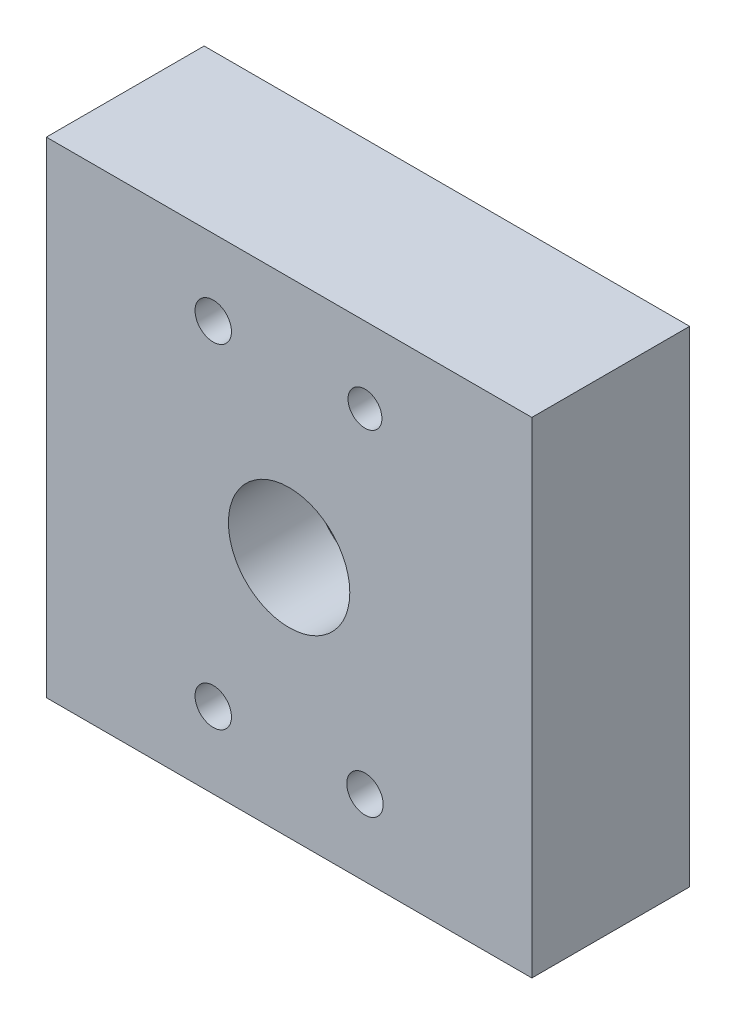
ISO-10303-21;
HEADER;
FILE_DESCRIPTION(('STEP AP214'),'2;1');
FILE_NAME('part.step','',(''),(''),'','','');
FILE_SCHEMA(('AUTOMOTIVE_DESIGN { 1 0 10303 214 1 1 1 1 }'));
ENDSEC;
DATA;
#1=APPLICATION_CONTEXT('core data for automotive mechanical design processes');
#2=APPLICATION_PROTOCOL_DEFINITION('international standard','automotive_design',2000,#1);
#3=PRODUCT_CONTEXT('',#1,'mechanical');
#4=PRODUCT('Part','Part','',(#3));
#5=PRODUCT_RELATED_PRODUCT_CATEGORY('part','',(#4));
#6=PRODUCT_DEFINITION_FORMATION('','',#4);
#7=PRODUCT_DEFINITION_CONTEXT('part definition',#1,'design');
#8=PRODUCT_DEFINITION('design','',#6,#7);
#9=PRODUCT_DEFINITION_SHAPE('','',#8);
#10=(LENGTH_UNIT() NAMED_UNIT(*) SI_UNIT(.MILLI.,.METRE.));
#11=(NAMED_UNIT(*) PLANE_ANGLE_UNIT() SI_UNIT($,.RADIAN.));
#12=(NAMED_UNIT(*) SI_UNIT($,.STERADIAN.) SOLID_ANGLE_UNIT());
#13=UNCERTAINTY_MEASURE_WITH_UNIT(LENGTH_MEASURE(1.E-05),#10,'distance_accuracy_value','');
#14=(GEOMETRIC_REPRESENTATION_CONTEXT(3) GLOBAL_UNCERTAINTY_ASSIGNED_CONTEXT((#13)) GLOBAL_UNIT_ASSIGNED_CONTEXT((#10,
#11,#12)) REPRESENTATION_CONTEXT('',''));
#15=CARTESIAN_POINT('',(0.,0.,0.));
#16=DIRECTION('',(0.,0.,1.));
#17=DIRECTION('',(1.,0.,0.));
#18=AXIS2_PLACEMENT_3D('',#15,#16,#17);
#19=CARTESIAN_POINT('',(-6.25,-13.75,27.));
#20=DIRECTION('',(0.,0.,-1.));
#21=DIRECTION('',(-1.,0.,0.));
#22=AXIS2_PLACEMENT_3D('',#19,#20,#21);
#23=CYLINDRICAL_SURFACE('',#22,1.5);
#24=CARTESIAN_POINT('',(-6.25,-13.75,13.));
#25=DIRECTION('',(0.,0.,1.));
#26=DIRECTION('',(1.,0.,0.));
#27=AXIS2_PLACEMENT_3D('',#24,#25,#26);
#28=CIRCLE('',#27,1.5);
#29=CARTESIAN_POINT('',(-4.75,-13.75,13.));
#30=VERTEX_POINT('',#29);
#31=EDGE_CURVE('E254',#30,#30,#28,.T.);
#32=ORIENTED_EDGE('',*,*,#31,.T.);
#33=EDGE_LOOP('',(#32));
#34=FACE_BOUND('',#33,.T.);
#35=CARTESIAN_POINT('',(-6.25,-13.75,3.));
#36=DIRECTION('',(0.,0.,-1.));
#37=DIRECTION('',(-1.,0.,0.));
#38=AXIS2_PLACEMENT_3D('',#35,#36,#37);
#39=CIRCLE('',#38,1.5);
#40=CARTESIAN_POINT('',(-7.75,-13.75,3.));
#41=VERTEX_POINT('',#40);
#42=EDGE_CURVE('E361',#41,#41,#39,.T.);
#43=ORIENTED_EDGE('',*,*,#42,.T.);
#44=EDGE_LOOP('',(#43));
#45=FACE_BOUND('',#44,.T.);
#46=ADVANCED_FACE('F47',(#34,#45),#23,.F.);
#47=CARTESIAN_POINT('',(6.25,-13.75,27.));
#48=DIRECTION('',(0.,0.,-1.));
#49=DIRECTION('',(-1.,0.,0.));
#50=AXIS2_PLACEMENT_3D('',#47,#48,#49);
#51=CYLINDRICAL_SURFACE('',#50,1.5);
#52=CARTESIAN_POINT('',(6.25,-13.75,13.));
#53=DIRECTION('',(0.,0.,1.));
#54=DIRECTION('',(1.,0.,0.));
#55=AXIS2_PLACEMENT_3D('',#52,#53,#54);
#56=CIRCLE('',#55,1.5);
#57=CARTESIAN_POINT('',(7.75,-13.75,13.));
#58=VERTEX_POINT('',#57);
#59=EDGE_CURVE('E257',#58,#58,#56,.T.);
#60=ORIENTED_EDGE('',*,*,#59,.T.);
#61=EDGE_LOOP('',(#60));
#62=FACE_BOUND('',#61,.T.);
#63=CARTESIAN_POINT('',(6.25,-13.75,3.));
#64=DIRECTION('',(0.,0.,-1.));
#65=DIRECTION('',(-1.,0.,0.));
#66=AXIS2_PLACEMENT_3D('',#63,#64,#65);
#67=CIRCLE('',#66,1.5);
#68=CARTESIAN_POINT('',(4.75,-13.75,3.));
#69=VERTEX_POINT('',#68);
#70=EDGE_CURVE('E347',#69,#69,#67,.T.);
#71=ORIENTED_EDGE('',*,*,#70,.T.);
#72=EDGE_LOOP('',(#71));
#73=FACE_BOUND('',#72,.T.);
#74=ADVANCED_FACE('F317',(#62,#73),#51,.F.);
#75=CARTESIAN_POINT('',(6.25000000000029,13.75,27.));
#76=DIRECTION('',(0.,0.,-1.));
#77=DIRECTION('',(-1.,0.,0.));
#78=AXIS2_PLACEMENT_3D('',#75,#76,#77);
#79=CYLINDRICAL_SURFACE('',#78,1.39539076412835);
#80=CARTESIAN_POINT('',(6.25000000000029,13.75,13.));
#81=DIRECTION('',(0.,0.,1.));
#82=DIRECTION('',(1.,0.,0.));
#83=AXIS2_PLACEMENT_3D('',#80,#81,#82);
#84=CIRCLE('',#83,1.39539076412835);
#85=CARTESIAN_POINT('',(7.64539076412863,13.75,13.));
#86=VERTEX_POINT('',#85);
#87=EDGE_CURVE('E260',#86,#86,#84,.T.);
#88=ORIENTED_EDGE('',*,*,#87,.T.);
#89=EDGE_LOOP('',(#88));
#90=FACE_BOUND('',#89,.T.);
#91=CARTESIAN_POINT('',(6.25000000000029,13.75,3.));
#92=DIRECTION('',(0.,0.,-1.));
#93=DIRECTION('',(-1.,0.,0.));
#94=AXIS2_PLACEMENT_3D('',#91,#92,#93);
#95=CIRCLE('',#94,1.39539076412835);
#96=CARTESIAN_POINT('',(4.85460923587194,13.75,3.));
#97=VERTEX_POINT('',#96);
#98=EDGE_CURVE('E51',#97,#97,#95,.F.);
#99=ORIENTED_EDGE('',*,*,#98,.F.);
#100=EDGE_LOOP('',(#99));
#101=FACE_BOUND('',#100,.T.);
#102=ADVANCED_FACE('F324',(#90,#101),#79,.F.);
#103=CARTESIAN_POINT('',(-6.24999999999972,13.75,27.));
#104=DIRECTION('',(0.,0.,-1.));
#105=DIRECTION('',(-1.,0.,0.));
#106=AXIS2_PLACEMENT_3D('',#103,#104,#105);
#107=CYLINDRICAL_SURFACE('',#106,1.5);
#108=CARTESIAN_POINT('',(-6.24999999999972,13.75,13.));
#109=DIRECTION('',(0.,0.,1.));
#110=DIRECTION('',(1.,0.,0.));
#111=AXIS2_PLACEMENT_3D('',#108,#109,#110);
#112=CIRCLE('',#111,1.5);
#113=CARTESIAN_POINT('',(-4.74999999999972,13.75,13.));
#114=VERTEX_POINT('',#113);
#115=EDGE_CURVE('E262',#114,#114,#112,.T.);
#116=ORIENTED_EDGE('',*,*,#115,.T.);
#117=EDGE_LOOP('',(#116));
#118=FACE_BOUND('',#117,.T.);
#119=CARTESIAN_POINT('',(-6.24999999999972,13.75,3.));
#120=DIRECTION('',(0.,0.,-1.));
#121=DIRECTION('',(-1.,0.,0.));
#122=AXIS2_PLACEMENT_3D('',#119,#120,#121);
#123=CIRCLE('',#122,1.5);
#124=CARTESIAN_POINT('',(-7.74999999999972,13.75,3.));
#125=VERTEX_POINT('',#124);
#126=EDGE_CURVE('E373',#125,#125,#123,.T.);
#127=ORIENTED_EDGE('',*,*,#126,.T.);
#128=EDGE_LOOP('',(#127));
#129=FACE_BOUND('',#128,.T.);
#130=ADVANCED_FACE('F330',(#118,#129),#107,.F.);
#131=CARTESIAN_POINT('',(13.,0.,6.));
#132=DIRECTION('',(1.,0.,0.));
#133=DIRECTION('',(0.,0.,-1.));
#134=AXIS2_PLACEMENT_3D('',#131,#132,#133);
#135=PLANE('',#134);
#136=DIRECTION('',(0.,-1.,0.));
#137=VECTOR('',#136,1.);
#138=CARTESIAN_POINT('',(13.,0.,0.));
#139=LINE('',#138,#137);
#140=CARTESIAN_POINT('',(13.,5.,0.));
#141=VERTEX_POINT('',#140);
#142=CARTESIAN_POINT('',(13.,-8.,0.));
#143=VERTEX_POINT('',#142);
#144=EDGE_CURVE('E220',#141,#143,#139,.T.);
#145=ORIENTED_EDGE('',*,*,#144,.T.);
#146=DIRECTION('',(0.,0.,-1.));
#147=VECTOR('',#146,1.);
#148=CARTESIAN_POINT('',(13.,-8.,6.));
#149=LINE('',#148,#147);
#150=CARTESIAN_POINT('',(13.,-8.,6.));
#151=VERTEX_POINT('',#150);
#152=EDGE_CURVE('E11',#151,#143,#149,.T.);
#153=ORIENTED_EDGE('',*,*,#152,.F.);
#154=DIRECTION('',(0.,-1.,0.));
#155=VECTOR('',#154,1.);
#156=CARTESIAN_POINT('',(13.,0.,6.));
#157=LINE('',#156,#155);
#158=CARTESIAN_POINT('',(13.,5.,6.));
#159=VERTEX_POINT('',#158);
#160=EDGE_CURVE('E177',#159,#151,#157,.T.);
#161=ORIENTED_EDGE('',*,*,#160,.F.);
#162=DIRECTION('',(0.,0.,-1.));
#163=VECTOR('',#162,1.);
#164=CARTESIAN_POINT('',(13.,5.,6.));
#165=LINE('',#164,#163);
#166=EDGE_CURVE('E238',#159,#141,#165,.T.);
#167=ORIENTED_EDGE('',*,*,#166,.T.);
#168=EDGE_LOOP('',(#145,#153,#161,#167));
#169=FACE_BOUND('',#168,.T.);
#170=ADVANCED_FACE('F302',(#169),#135,.F.);
#171=CARTESIAN_POINT('',(0.,-8.,6.));
#172=DIRECTION('',(0.,-1.,0.));
#173=DIRECTION('',(0.,0.,-1.));
#174=AXIS2_PLACEMENT_3D('',#171,#172,#173);
#175=PLANE('',#174);
#176=DIRECTION('',(-1.,0.,0.));
#177=VECTOR('',#176,1.);
#178=CARTESIAN_POINT('',(0.,-8.,0.));
#179=LINE('',#178,#177);
#180=CARTESIAN_POINT('',(5.,-8.,0.));
#181=VERTEX_POINT('',#180);
#182=EDGE_CURVE('E223',#143,#181,#179,.T.);
#183=ORIENTED_EDGE('',*,*,#182,.T.);
#184=DIRECTION('',(0.,0.,-1.));
#185=VECTOR('',#184,1.);
#186=CARTESIAN_POINT('',(5.,-8.,6.));
#187=LINE('',#186,#185);
#188=CARTESIAN_POINT('',(5.,-8.,6.));
#189=VERTEX_POINT('',#188);
#190=EDGE_CURVE('E56',#189,#181,#187,.T.);
#191=ORIENTED_EDGE('',*,*,#190,.F.);
#192=DIRECTION('',(-1.,0.,0.));
#193=VECTOR('',#192,1.);
#194=CARTESIAN_POINT('',(0.,-8.,6.));
#195=LINE('',#194,#193);
#196=EDGE_CURVE('E187',#151,#189,#195,.T.);
#197=ORIENTED_EDGE('',*,*,#196,.F.);
#198=ORIENTED_EDGE('',*,*,#152,.T.);
#199=EDGE_LOOP('',(#183,#191,#197,#198));
#200=FACE_BOUND('',#199,.T.);
#201=ADVANCED_FACE('F300',(#200),#175,.F.);
#202=CARTESIAN_POINT('',(5.,0.,6.));
#203=DIRECTION('',(1.,0.,0.));
#204=DIRECTION('',(0.,1.,0.));
#205=AXIS2_PLACEMENT_3D('',#202,#203,#204);
#206=PLANE('',#205);
#207=DIRECTION('',(0.,-1.,0.));
#208=VECTOR('',#207,1.);
#209=CARTESIAN_POINT('',(5.,0.,0.));
#210=LINE('',#209,#208);
#211=CARTESIAN_POINT('',(5.,-5.,0.));
#212=VERTEX_POINT('',#211);
#213=EDGE_CURVE('E226',#212,#181,#210,.T.);
#214=ORIENTED_EDGE('',*,*,#213,.F.);
#215=DIRECTION('',(0.,0.,-1.));
#216=VECTOR('',#215,1.);
#217=CARTESIAN_POINT('',(5.,-5.,6.));
#218=LINE('',#217,#216);
#219=CARTESIAN_POINT('',(5.,-5.,6.));
#220=VERTEX_POINT('',#219);
#221=EDGE_CURVE('E247',#220,#212,#218,.T.);
#222=ORIENTED_EDGE('',*,*,#221,.F.);
#223=DIRECTION('',(0.,-1.,0.));
#224=VECTOR('',#223,1.);
#225=CARTESIAN_POINT('',(5.,0.,6.));
#226=LINE('',#225,#224);
#227=EDGE_CURVE('E190',#220,#189,#226,.T.);
#228=ORIENTED_EDGE('',*,*,#227,.T.);
#229=ORIENTED_EDGE('',*,*,#190,.T.);
#230=EDGE_LOOP('',(#214,#222,#228,#229));
#231=FACE_BOUND('',#230,.T.);
#232=ADVANCED_FACE('F297',(#231),#206,.T.);
#233=CARTESIAN_POINT('',(0.,-5.,6.));
#234=DIRECTION('',(0.,1.,0.));
#235=DIRECTION('',(0.,0.,1.));
#236=AXIS2_PLACEMENT_3D('',#233,#234,#235);
#237=PLANE('',#236);
#238=DIRECTION('',(1.,0.,0.));
#239=VECTOR('',#238,1.);
#240=CARTESIAN_POINT('',(0.,-5.,0.));
#241=LINE('',#240,#239);
#242=CARTESIAN_POINT('',(-5.,-5.,0.));
#243=VERTEX_POINT('',#242);
#244=EDGE_CURVE('E229',#243,#212,#241,.T.);
#245=ORIENTED_EDGE('',*,*,#244,.F.);
#246=DIRECTION('',(0.,0.,-1.));
#247=VECTOR('',#246,1.);
#248=CARTESIAN_POINT('',(-5.,-5.,6.));
#249=LINE('',#248,#247);
#250=CARTESIAN_POINT('',(-5.,-5.,6.));
#251=VERTEX_POINT('',#250);
#252=EDGE_CURVE('E245',#251,#243,#249,.T.);
#253=ORIENTED_EDGE('',*,*,#252,.F.);
#254=DIRECTION('',(1.,0.,0.));
#255=VECTOR('',#254,1.);
#256=CARTESIAN_POINT('',(0.,-5.,6.));
#257=LINE('',#256,#255);
#258=CARTESIAN_POINT('',(0.,-5.,6.));
#259=VERTEX_POINT('',#258);
#260=EDGE_CURVE('E194',#251,#259,#257,.T.);
#261=ORIENTED_EDGE('',*,*,#260,.T.);
#262=EDGE_CURVE('E193',#259,#220,#257,.T.);
#263=ORIENTED_EDGE('',*,*,#262,.T.);
#264=ORIENTED_EDGE('',*,*,#221,.T.);
#265=EDGE_LOOP('',(#245,#253,#261,#263,#264));
#266=FACE_BOUND('',#265,.T.);
#267=ADVANCED_FACE('F292',(#266),#237,.T.);
#268=CARTESIAN_POINT('',(-5.,0.,6.));
#269=DIRECTION('',(-1.,0.,0.));
#270=DIRECTION('',(0.,0.,1.));
#271=AXIS2_PLACEMENT_3D('',#268,#269,#270);
#272=PLANE('',#271);
#273=DIRECTION('',(0.,1.,0.));
#274=VECTOR('',#273,1.);
#275=CARTESIAN_POINT('',(-5.,0.,0.));
#276=LINE('',#275,#274);
#277=CARTESIAN_POINT('',(-5.,5.,0.));
#278=VERTEX_POINT('',#277);
#279=EDGE_CURVE('E232',#243,#278,#276,.T.);
#280=ORIENTED_EDGE('',*,*,#279,.T.);
#281=DIRECTION('',(0.,0.,-1.));
#282=VECTOR('',#281,1.);
#283=CARTESIAN_POINT('',(-5.,5.,6.));
#284=LINE('',#283,#282);
#285=CARTESIAN_POINT('',(-5.,5.,6.));
#286=VERTEX_POINT('',#285);
#287=EDGE_CURVE('E241',#286,#278,#284,.T.);
#288=ORIENTED_EDGE('',*,*,#287,.F.);
#289=DIRECTION('',(0.,1.,0.));
#290=VECTOR('',#289,1.);
#291=CARTESIAN_POINT('',(-5.,0.,6.));
#292=LINE('',#291,#290);
#293=CARTESIAN_POINT('',(-5.,0.,6.));
#294=VERTEX_POINT('',#293);
#295=EDGE_CURVE('E72',#294,#286,#292,.T.);
#296=ORIENTED_EDGE('',*,*,#295,.F.);
#297=EDGE_CURVE('E196',#251,#294,#292,.T.);
#298=ORIENTED_EDGE('',*,*,#297,.F.);
#299=ORIENTED_EDGE('',*,*,#252,.T.);
#300=EDGE_LOOP('',(#280,#288,#296,#298,#299));
#301=FACE_BOUND('',#300,.T.);
#302=ADVANCED_FACE('F283',(#301),#272,.F.);
#303=CARTESIAN_POINT('',(20.,0.,6.));
#304=DIRECTION('',(-1.,0.,0.));
#305=DIRECTION('',(0.,0.,1.));
#306=AXIS2_PLACEMENT_3D('',#303,#304,#305);
#307=PLANE('',#306);
#308=DIRECTION('',(0.,1.,0.));
#309=VECTOR('',#308,1.);
#310=CARTESIAN_POINT('',(20.,0.,0.));
#311=LINE('',#310,#309);
#312=CARTESIAN_POINT('',(20.,-20.,0.));
#313=VERTEX_POINT('',#312);
#314=CARTESIAN_POINT('',(20.,20.,0.));
#315=VERTEX_POINT('',#314);
#316=EDGE_CURVE('E211',#313,#315,#311,.T.);
#317=ORIENTED_EDGE('',*,*,#316,.T.);
#318=DIRECTION('',(0.,0.,-1.));
#319=VECTOR('',#318,1.);
#320=CARTESIAN_POINT('',(20.,20.,6.));
#321=LINE('',#320,#319);
#322=CARTESIAN_POINT('',(20.,20.,13.));
#323=VERTEX_POINT('',#322);
#324=EDGE_CURVE('E242',#323,#315,#321,.T.);
#325=ORIENTED_EDGE('',*,*,#324,.F.);
#326=DIRECTION('',(0.,1.,0.));
#327=VECTOR('',#326,1.);
#328=CARTESIAN_POINT('',(20.,20.,13.));
#329=LINE('',#328,#327);
#330=CARTESIAN_POINT('',(20.,-20.,13.));
#331=VERTEX_POINT('',#330);
#332=EDGE_CURVE('E157',#331,#323,#329,.T.);
#333=ORIENTED_EDGE('',*,*,#332,.F.);
#334=DIRECTION('',(0.,0.,-1.));
#335=VECTOR('',#334,1.);
#336=CARTESIAN_POINT('',(20.,-20.,6.));
#337=LINE('',#336,#335);
#338=EDGE_CURVE('E149',#331,#313,#337,.T.);
#339=ORIENTED_EDGE('',*,*,#338,.T.);
#340=EDGE_LOOP('',(#317,#325,#333,#339));
#341=FACE_BOUND('',#340,.T.);
#342=ADVANCED_FACE('F396',(#341),#307,.F.);
#343=CARTESIAN_POINT('',(0.,20.,6.));
#344=DIRECTION('',(0.,-1.,0.));
#345=DIRECTION('',(0.,0.,-1.));
#346=AXIS2_PLACEMENT_3D('',#343,#344,#345);
#347=PLANE('',#346);
#348=DIRECTION('',(-1.,0.,0.));
#349=VECTOR('',#348,1.);
#350=CARTESIAN_POINT('',(0.,20.,0.));
#351=LINE('',#350,#349);
#352=CARTESIAN_POINT('',(-20.,20.,0.));
#353=VERTEX_POINT('',#352);
#354=EDGE_CURVE('E214',#315,#353,#351,.T.);
#355=ORIENTED_EDGE('',*,*,#354,.T.);
#356=DIRECTION('',(0.,0.,-1.));
#357=VECTOR('',#356,1.);
#358=CARTESIAN_POINT('',(-20.,20.,6.));
#359=LINE('',#358,#357);
#360=CARTESIAN_POINT('',(-20.,20.,13.));
#361=VERTEX_POINT('',#360);
#362=EDGE_CURVE('E148',#361,#353,#359,.T.);
#363=ORIENTED_EDGE('',*,*,#362,.F.);
#364=DIRECTION('',(-1.,0.,0.));
#365=VECTOR('',#364,1.);
#366=CARTESIAN_POINT('',(-20.,20.,13.));
#367=LINE('',#366,#365);
#368=EDGE_CURVE('E163',#323,#361,#367,.T.);
#369=ORIENTED_EDGE('',*,*,#368,.F.);
#370=ORIENTED_EDGE('',*,*,#324,.T.);
#371=EDGE_LOOP('',(#355,#363,#369,#370));
#372=FACE_BOUND('',#371,.T.);
#373=ADVANCED_FACE('F398',(#372),#347,.F.);
#374=CARTESIAN_POINT('',(-20.,0.,6.));
#375=DIRECTION('',(-1.,0.,0.));
#376=DIRECTION('',(0.,0.,1.));
#377=AXIS2_PLACEMENT_3D('',#374,#375,#376);
#378=PLANE('',#377);
#379=DIRECTION('',(0.,1.,0.));
#380=VECTOR('',#379,1.);
#381=CARTESIAN_POINT('',(-20.,0.,0.));
#382=LINE('',#381,#380);
#383=CARTESIAN_POINT('',(-20.,-20.,0.));
#384=VERTEX_POINT('',#383);
#385=EDGE_CURVE('E144',#384,#353,#382,.T.);
#386=ORIENTED_EDGE('',*,*,#385,.F.);
#387=DIRECTION('',(0.,0.,-1.));
#388=VECTOR('',#387,1.);
#389=CARTESIAN_POINT('',(-20.,-20.,6.));
#390=LINE('',#389,#388);
#391=CARTESIAN_POINT('',(-20.,-20.,13.));
#392=VERTEX_POINT('',#391);
#393=EDGE_CURVE('E138',#392,#384,#390,.T.);
#394=ORIENTED_EDGE('',*,*,#393,.F.);
#395=DIRECTION('',(0.,-1.,0.));
#396=VECTOR('',#395,1.);
#397=CARTESIAN_POINT('',(-20.,20.,13.));
#398=LINE('',#397,#396);
#399=EDGE_CURVE('E142',#361,#392,#398,.T.);
#400=ORIENTED_EDGE('',*,*,#399,.F.);
#401=ORIENTED_EDGE('',*,*,#362,.T.);
#402=EDGE_LOOP('',(#386,#394,#400,#401));
#403=FACE_BOUND('',#402,.T.);
#404=ADVANCED_FACE('F140',(#403),#378,.T.);
#405=CARTESIAN_POINT('',(0.,5.,6.));
#406=DIRECTION('',(0.,1.,0.));
#407=DIRECTION('',(-1.,0.,0.));
#408=AXIS2_PLACEMENT_3D('',#405,#406,#407);
#409=PLANE('',#408);
#410=DIRECTION('',(1.,0.,0.));
#411=VECTOR('',#410,1.);
#412=CARTESIAN_POINT('',(0.,5.,0.));
#413=LINE('',#412,#411);
#414=EDGE_CURVE('E234',#278,#141,#413,.T.);
#415=ORIENTED_EDGE('',*,*,#414,.T.);
#416=ORIENTED_EDGE('',*,*,#166,.F.);
#417=DIRECTION('',(1.,0.,0.));
#418=VECTOR('',#417,1.);
#419=CARTESIAN_POINT('',(0.,5.,6.));
#420=LINE('',#419,#418);
#421=CARTESIAN_POINT('',(0.,5.,6.));
#422=VERTEX_POINT('',#421);
#423=EDGE_CURVE('E64',#422,#159,#420,.T.);
#424=ORIENTED_EDGE('',*,*,#423,.F.);
#425=EDGE_CURVE('E198',#286,#422,#420,.T.);
#426=ORIENTED_EDGE('',*,*,#425,.F.);
#427=ORIENTED_EDGE('',*,*,#287,.T.);
#428=EDGE_LOOP('',(#415,#416,#424,#426,#427));
#429=FACE_BOUND('',#428,.T.);
#430=ADVANCED_FACE('F303',(#429),#409,.F.);
#431=CARTESIAN_POINT('',(0.,-20.,6.));
#432=DIRECTION('',(0.,-1.,0.));
#433=DIRECTION('',(0.,0.,-1.));
#434=AXIS2_PLACEMENT_3D('',#431,#432,#433);
#435=PLANE('',#434);
#436=DIRECTION('',(-1.,0.,0.));
#437=VECTOR('',#436,1.);
#438=CARTESIAN_POINT('',(0.,-20.,0.));
#439=LINE('',#438,#437);
#440=EDGE_CURVE('E218',#313,#384,#439,.T.);
#441=ORIENTED_EDGE('',*,*,#440,.F.);
#442=ORIENTED_EDGE('',*,*,#338,.F.);
#443=DIRECTION('',(1.,0.,0.));
#444=VECTOR('',#443,1.);
#445=CARTESIAN_POINT('',(-20.,-20.,13.));
#446=LINE('',#445,#444);
#447=EDGE_CURVE('E152',#392,#331,#446,.T.);
#448=ORIENTED_EDGE('',*,*,#447,.F.);
#449=ORIENTED_EDGE('',*,*,#393,.T.);
#450=EDGE_LOOP('',(#441,#442,#448,#449));
#451=FACE_BOUND('',#450,.T.);
#452=ADVANCED_FACE('F153',(#451),#435,.T.);
#453=CARTESIAN_POINT('',(0.,-10.5,6.));
#454=DIRECTION('',(0.,0.,-1.));
#455=DIRECTION('',(-1.,0.,0.));
#456=AXIS2_PLACEMENT_3D('',#453,#454,#455);
#457=CYLINDRICAL_SURFACE('',#456,0.9);
#458=CARTESIAN_POINT('',(0.,-10.5,6.));
#459=DIRECTION('',(0.,0.,1.));
#460=DIRECTION('',(1.,0.,0.));
#461=AXIS2_PLACEMENT_3D('',#458,#459,#460);
#462=CIRCLE('',#461,0.9);
#463=CARTESIAN_POINT('',(0.900000000000002,-10.5,6.));
#464=VERTEX_POINT('',#463);
#465=EDGE_CURVE('E173',#464,#464,#462,.T.);
#466=ORIENTED_EDGE('',*,*,#465,.T.);
#467=EDGE_LOOP('',(#466));
#468=FACE_BOUND('',#467,.T.);
#469=CARTESIAN_POINT('',(0.,-10.5,0.));
#470=DIRECTION('',(0.,0.,1.));
#471=DIRECTION('',(1.,0.,0.));
#472=AXIS2_PLACEMENT_3D('',#469,#470,#471);
#473=CIRCLE('',#472,0.9);
#474=CARTESIAN_POINT('',(0.900000000000002,-10.5,0.));
#475=VERTEX_POINT('',#474);
#476=EDGE_CURVE('E208',#475,#475,#473,.T.);
#477=ORIENTED_EDGE('',*,*,#476,.F.);
#478=EDGE_LOOP('',(#477));
#479=FACE_BOUND('',#478,.T.);
#480=ADVANCED_FACE('F409',(#468,#479),#457,.F.);
#481=CARTESIAN_POINT('',(-12.5,-10.5,6.));
#482=DIRECTION('',(0.,0.,-1.));
#483=DIRECTION('',(-1.,0.,0.));
#484=AXIS2_PLACEMENT_3D('',#481,#482,#483);
#485=CYLINDRICAL_SURFACE('',#484,0.9);
#486=CARTESIAN_POINT('',(-12.5,-10.5,6.));
#487=DIRECTION('',(0.,0.,1.));
#488=DIRECTION('',(1.,0.,0.));
#489=AXIS2_PLACEMENT_3D('',#486,#487,#488);
#490=CIRCLE('',#489,0.9);
#491=CARTESIAN_POINT('',(-11.6,-10.5,6.));
#492=VERTEX_POINT('',#491);
#493=EDGE_CURVE('E179',#492,#492,#490,.T.);
#494=ORIENTED_EDGE('',*,*,#493,.T.);
#495=EDGE_LOOP('',(#494));
#496=FACE_BOUND('',#495,.T.);
#497=CARTESIAN_POINT('',(-12.5,-10.5,0.));
#498=DIRECTION('',(0.,0.,1.));
#499=DIRECTION('',(1.,0.,0.));
#500=AXIS2_PLACEMENT_3D('',#497,#498,#499);
#501=CIRCLE('',#500,0.9);
#502=CARTESIAN_POINT('',(-11.6,-10.5,0.));
#503=VERTEX_POINT('',#502);
#504=EDGE_CURVE('E205',#503,#503,#501,.T.);
#505=ORIENTED_EDGE('',*,*,#504,.F.);
#506=EDGE_LOOP('',(#505));
#507=FACE_BOUND('',#506,.T.);
#508=ADVANCED_FACE('F411',(#496,#507),#485,.F.);
#509=CARTESIAN_POINT('',(0.,10.5,6.));
#510=DIRECTION('',(0.,0.,-1.));
#511=DIRECTION('',(-1.,0.,0.));
#512=AXIS2_PLACEMENT_3D('',#509,#510,#511);
#513=CYLINDRICAL_SURFACE('',#512,0.9);
#514=CARTESIAN_POINT('',(0.,10.5,6.));
#515=DIRECTION('',(0.,0.,1.));
#516=DIRECTION('',(1.,0.,0.));
#517=AXIS2_PLACEMENT_3D('',#514,#515,#516);
#518=CIRCLE('',#517,0.9);
#519=CARTESIAN_POINT('',(0.900000000000005,10.5,6.));
#520=VERTEX_POINT('',#519);
#521=EDGE_CURVE('E174',#520,#520,#518,.F.);
#522=ORIENTED_EDGE('',*,*,#521,.F.);
#523=EDGE_LOOP('',(#522));
#524=FACE_BOUND('',#523,.T.);
#525=CARTESIAN_POINT('',(0.,10.5,0.));
#526=DIRECTION('',(0.,0.,1.));
#527=DIRECTION('',(1.,0.,0.));
#528=AXIS2_PLACEMENT_3D('',#525,#526,#527);
#529=CIRCLE('',#528,0.9);
#530=CARTESIAN_POINT('',(0.900000000000005,10.5,0.));
#531=VERTEX_POINT('',#530);
#532=EDGE_CURVE('E182',#531,#531,#529,.F.);
#533=ORIENTED_EDGE('',*,*,#532,.T.);
#534=EDGE_LOOP('',(#533));
#535=FACE_BOUND('',#534,.T.);
#536=ADVANCED_FACE('F49',(#524,#535),#513,.F.);
#537=CARTESIAN_POINT('',(-12.5,10.5,6.));
#538=DIRECTION('',(0.,0.,-1.));
#539=DIRECTION('',(-1.,0.,0.));
#540=AXIS2_PLACEMENT_3D('',#537,#538,#539);
#541=CYLINDRICAL_SURFACE('',#540,0.9);
#542=CARTESIAN_POINT('',(-12.5,10.5,6.));
#543=DIRECTION('',(0.,0.,1.));
#544=DIRECTION('',(1.,0.,0.));
#545=AXIS2_PLACEMENT_3D('',#542,#543,#544);
#546=CIRCLE('',#545,0.9);
#547=CARTESIAN_POINT('',(-11.6,10.5,6.));
#548=VERTEX_POINT('',#547);
#549=EDGE_CURVE('E200',#548,#548,#546,.F.);
#550=ORIENTED_EDGE('',*,*,#549,.F.);
#551=EDGE_LOOP('',(#550));
#552=FACE_BOUND('',#551,.T.);
#553=CARTESIAN_POINT('',(-12.5,10.5,0.));
#554=DIRECTION('',(0.,0.,1.));
#555=DIRECTION('',(1.,0.,0.));
#556=AXIS2_PLACEMENT_3D('',#553,#554,#555);
#557=CIRCLE('',#556,0.9);
#558=CARTESIAN_POINT('',(-11.6,10.5,0.));
#559=VERTEX_POINT('',#558);
#560=EDGE_CURVE('E178',#559,#559,#557,.F.);
#561=ORIENTED_EDGE('',*,*,#560,.T.);
#562=EDGE_LOOP('',(#561));
#563=FACE_BOUND('',#562,.T.);
#564=ADVANCED_FACE('F386',(#552,#563),#541,.F.);
#565=CARTESIAN_POINT('',(0.,0.,0.));
#566=DIRECTION('',(0.,0.,1.));
#567=DIRECTION('',(1.,0.,0.));
#568=AXIS2_PLACEMENT_3D('',#565,#566,#567);
#569=PLANE('',#568);
#570=CARTESIAN_POINT('',(6.25000000000029,13.75,0.));
#571=DIRECTION('',(0.,0.,-1.));
#572=DIRECTION('',(-1.,0.,0.));
#573=AXIS2_PLACEMENT_3D('',#570,#571,#572);
#574=CIRCLE('',#573,3.);
#575=CARTESIAN_POINT('',(3.25000000000028,13.75,0.));
#576=VERTEX_POINT('',#575);
#577=EDGE_CURVE('E365',#576,#576,#574,.T.);
#578=ORIENTED_EDGE('',*,*,#577,.F.);
#579=EDGE_LOOP('',(#578));
#580=FACE_BOUND('',#579,.T.);
#581=CARTESIAN_POINT('',(-6.25,-13.75,0.));
#582=DIRECTION('',(0.,0.,-1.));
#583=DIRECTION('',(-1.,0.,0.));
#584=AXIS2_PLACEMENT_3D('',#581,#582,#583);
#585=CIRCLE('',#584,3.);
#586=CARTESIAN_POINT('',(-9.25,-13.75,0.));
#587=VERTEX_POINT('',#586);
#588=EDGE_CURVE('E356',#587,#587,#585,.T.);
#589=ORIENTED_EDGE('',*,*,#588,.F.);
#590=EDGE_LOOP('',(#589));
#591=FACE_BOUND('',#590,.T.);
#592=CARTESIAN_POINT('',(6.25,-13.75,0.));
#593=DIRECTION('',(0.,0.,-1.));
#594=DIRECTION('',(-1.,0.,0.));
#595=AXIS2_PLACEMENT_3D('',#592,#593,#594);
#596=CIRCLE('',#595,3.);
#597=CARTESIAN_POINT('',(3.25,-13.75,0.));
#598=VERTEX_POINT('',#597);
#599=EDGE_CURVE('E349',#598,#598,#596,.T.);
#600=ORIENTED_EDGE('',*,*,#599,.F.);
#601=EDGE_LOOP('',(#600));
#602=FACE_BOUND('',#601,.T.);
#603=CARTESIAN_POINT('',(-6.24999999999972,13.75,0.));
#604=DIRECTION('',(0.,0.,-1.));
#605=DIRECTION('',(-1.,0.,0.));
#606=AXIS2_PLACEMENT_3D('',#603,#604,#605);
#607=CIRCLE('',#606,3.);
#608=CARTESIAN_POINT('',(-9.24999999999972,13.75,0.));
#609=VERTEX_POINT('',#608);
#610=EDGE_CURVE('E353',#609,#609,#607,.T.);
#611=ORIENTED_EDGE('',*,*,#610,.F.);
#612=EDGE_LOOP('',(#611));
#613=FACE_BOUND('',#612,.T.);
#614=ORIENTED_EDGE('',*,*,#532,.F.);
#615=EDGE_LOOP('',(#614));
#616=FACE_BOUND('',#615,.T.);
#617=ORIENTED_EDGE('',*,*,#504,.T.);
#618=EDGE_LOOP('',(#617));
#619=FACE_BOUND('',#618,.T.);
#620=ORIENTED_EDGE('',*,*,#476,.T.);
#621=EDGE_LOOP('',(#620));
#622=FACE_BOUND('',#621,.T.);
#623=ORIENTED_EDGE('',*,*,#316,.F.);
#624=ORIENTED_EDGE('',*,*,#440,.T.);
#625=ORIENTED_EDGE('',*,*,#385,.T.);
#626=ORIENTED_EDGE('',*,*,#354,.F.);
#627=EDGE_LOOP('',(#623,#624,#625,#626));
#628=FACE_BOUND('',#627,.T.);
#629=ORIENTED_EDGE('',*,*,#144,.F.);
#630=ORIENTED_EDGE('',*,*,#414,.F.);
#631=ORIENTED_EDGE('',*,*,#279,.F.);
#632=ORIENTED_EDGE('',*,*,#244,.T.);
#633=ORIENTED_EDGE('',*,*,#213,.T.);
#634=ORIENTED_EDGE('',*,*,#182,.F.);
#635=EDGE_LOOP('',(#629,#630,#631,#632,#633,#634));
#636=FACE_BOUND('',#635,.T.);
#637=ORIENTED_EDGE('',*,*,#560,.F.);
#638=EDGE_LOOP('',(#637));
#639=FACE_BOUND('',#638,.T.);
#640=ADVANCED_FACE('F290',(#580,#591,#602,#613,#616,#619,#622,#628,#636,#639),#569,.F.);
#641=CARTESIAN_POINT('',(0.,0.,6.));
#642=DIRECTION('',(0.,0.,1.));
#643=DIRECTION('',(1.,0.,0.));
#644=AXIS2_PLACEMENT_3D('',#641,#642,#643);
#645=PLANE('',#644);
#646=ORIENTED_EDGE('',*,*,#549,.T.);
#647=EDGE_LOOP('',(#646));
#648=FACE_BOUND('',#647,.T.);
#649=ADVANCED_FACE('F313',(#648),#645,.F.);
#650=CARTESIAN_POINT('',(0.,0.,13.));
#651=DIRECTION('',(0.,0.,-1.));
#652=DIRECTION('',(-1.,0.,0.));
#653=AXIS2_PLACEMENT_3D('',#650,#651,#652);
#654=CYLINDRICAL_SURFACE('',#653,5.);
#655=CARTESIAN_POINT('',(0.,0.,13.));
#656=DIRECTION('',(0.,0.,1.));
#657=DIRECTION('',(1.,0.,0.));
#658=AXIS2_PLACEMENT_3D('',#655,#656,#657);
#659=CIRCLE('',#658,5.);
#660=CARTESIAN_POINT('',(5.,0.,13.));
#661=VERTEX_POINT('',#660);
#662=EDGE_CURVE('E164',#661,#661,#659,.T.);
#663=ORIENTED_EDGE('',*,*,#662,.T.);
#664=EDGE_LOOP('',(#663));
#665=FACE_BOUND('',#664,.T.);
#666=CARTESIAN_POINT('',(0.,0.,6.));
#667=DIRECTION('',(0.,0.,1.));
#668=DIRECTION('',(1.,0.,0.));
#669=AXIS2_PLACEMENT_3D('',#666,#667,#668);
#670=CIRCLE('',#669,5.);
#671=EDGE_CURVE('E167',#422,#294,#670,.T.);
#672=ORIENTED_EDGE('',*,*,#671,.F.);
#673=EDGE_CURVE('E264',#259,#422,#670,.T.);
#674=ORIENTED_EDGE('',*,*,#673,.F.);
#675=EDGE_CURVE('E268',#294,#259,#670,.T.);
#676=ORIENTED_EDGE('',*,*,#675,.F.);
#677=EDGE_LOOP('',(#672,#674,#676));
#678=FACE_BOUND('',#677,.T.);
#679=ADVANCED_FACE('F279',(#665,#678),#654,.F.);
#680=CARTESIAN_POINT('',(0.,0.,13.));
#681=DIRECTION('',(0.,0.,1.));
#682=DIRECTION('',(1.,0.,0.));
#683=AXIS2_PLACEMENT_3D('',#680,#681,#682);
#684=PLANE('',#683);
#685=ORIENTED_EDGE('',*,*,#115,.F.);
#686=EDGE_LOOP('',(#685));
#687=FACE_BOUND('',#686,.T.);
#688=ORIENTED_EDGE('',*,*,#87,.F.);
#689=EDGE_LOOP('',(#688));
#690=FACE_BOUND('',#689,.T.);
#691=ORIENTED_EDGE('',*,*,#59,.F.);
#692=EDGE_LOOP('',(#691));
#693=FACE_BOUND('',#692,.T.);
#694=ORIENTED_EDGE('',*,*,#31,.F.);
#695=EDGE_LOOP('',(#694));
#696=FACE_BOUND('',#695,.T.);
#697=ORIENTED_EDGE('',*,*,#399,.T.);
#698=ORIENTED_EDGE('',*,*,#447,.T.);
#699=ORIENTED_EDGE('',*,*,#332,.T.);
#700=ORIENTED_EDGE('',*,*,#368,.T.);
#701=EDGE_LOOP('',(#697,#698,#699,#700));
#702=FACE_BOUND('',#701,.T.);
#703=ORIENTED_EDGE('',*,*,#662,.F.);
#704=EDGE_LOOP('',(#703));
#705=FACE_BOUND('',#704,.T.);
#706=ADVANCED_FACE('F160',(#687,#690,#693,#696,#702,#705),#684,.T.);
#707=ORIENTED_EDGE('',*,*,#671,.T.);
#708=ORIENTED_EDGE('',*,*,#295,.T.);
#709=ORIENTED_EDGE('',*,*,#425,.T.);
#710=EDGE_LOOP('',(#707,#708,#709));
#711=FACE_BOUND('',#710,.T.);
#712=ADVANCED_FACE('F276',(#711),#645,.F.);
#713=ORIENTED_EDGE('',*,*,#160,.T.);
#714=ORIENTED_EDGE('',*,*,#196,.T.);
#715=ORIENTED_EDGE('',*,*,#227,.F.);
#716=ORIENTED_EDGE('',*,*,#262,.F.);
#717=ORIENTED_EDGE('',*,*,#673,.T.);
#718=ORIENTED_EDGE('',*,*,#423,.T.);
#719=EDGE_LOOP('',(#713,#714,#715,#716,#717,#718));
#720=FACE_BOUND('',#719,.T.);
#721=ADVANCED_FACE('F304',(#720),#645,.F.);
#722=ORIENTED_EDGE('',*,*,#260,.F.);
#723=ORIENTED_EDGE('',*,*,#297,.T.);
#724=ORIENTED_EDGE('',*,*,#675,.T.);
#725=EDGE_LOOP('',(#722,#723,#724));
#726=FACE_BOUND('',#725,.T.);
#727=ADVANCED_FACE('F282',(#726),#645,.F.);
#728=ORIENTED_EDGE('',*,*,#465,.F.);
#729=EDGE_LOOP('',(#728));
#730=FACE_BOUND('',#729,.T.);
#731=ADVANCED_FACE('F311',(#730),#645,.F.);
#732=ORIENTED_EDGE('',*,*,#493,.F.);
#733=EDGE_LOOP('',(#732));
#734=FACE_BOUND('',#733,.T.);
#735=ADVANCED_FACE('F422',(#734),#645,.F.);
#736=ORIENTED_EDGE('',*,*,#521,.T.);
#737=EDGE_LOOP('',(#736));
#738=FACE_BOUND('',#737,.T.);
#739=ADVANCED_FACE('F312',(#738),#645,.F.);
#740=CARTESIAN_POINT('',(-6.24999999999972,13.75,3.));
#741=DIRECTION('',(0.,0.,-1.));
#742=DIRECTION('',(-1.,0.,0.));
#743=AXIS2_PLACEMENT_3D('',#740,#741,#742);
#744=CYLINDRICAL_SURFACE('',#743,3.);
#745=CARTESIAN_POINT('',(-6.24999999999972,13.75,3.));
#746=DIRECTION('',(0.,0.,-1.));
#747=DIRECTION('',(-1.,0.,0.));
#748=AXIS2_PLACEMENT_3D('',#745,#746,#747);
#749=CIRCLE('',#748,3.);
#750=CARTESIAN_POINT('',(-9.24999999999972,13.75,3.));
#751=VERTEX_POINT('',#750);
#752=EDGE_CURVE('E376',#751,#751,#749,.T.);
#753=ORIENTED_EDGE('',*,*,#752,.F.);
#754=EDGE_LOOP('',(#753));
#755=FACE_BOUND('',#754,.T.);
#756=ORIENTED_EDGE('',*,*,#610,.T.);
#757=EDGE_LOOP('',(#756));
#758=FACE_BOUND('',#757,.T.);
#759=ADVANCED_FACE('F382',(#755,#758),#744,.F.);
#760=CARTESIAN_POINT('',(0.,0.,3.));
#761=DIRECTION('',(0.,0.,-1.));
#762=DIRECTION('',(-1.,0.,0.));
#763=AXIS2_PLACEMENT_3D('',#760,#761,#762);
#764=PLANE('',#763);
#765=ORIENTED_EDGE('',*,*,#126,.F.);
#766=EDGE_LOOP('',(#765));
#767=FACE_BOUND('',#766,.T.);
#768=ORIENTED_EDGE('',*,*,#752,.T.);
#769=EDGE_LOOP('',(#768));
#770=FACE_BOUND('',#769,.T.);
#771=ADVANCED_FACE('F565',(#767,#770),#764,.T.);
#772=CARTESIAN_POINT('',(6.25000000000029,13.75,3.));
#773=DIRECTION('',(0.,0.,-1.));
#774=DIRECTION('',(-1.,0.,0.));
#775=AXIS2_PLACEMENT_3D('',#772,#773,#774);
#776=PLANE('',#775);
#777=CARTESIAN_POINT('',(6.25000000000029,13.75,3.));
#778=DIRECTION('',(0.,0.,-1.));
#779=DIRECTION('',(-1.,0.,0.));
#780=AXIS2_PLACEMENT_3D('',#777,#778,#779);
#781=CIRCLE('',#780,3.);
#782=CARTESIAN_POINT('',(3.25000000000028,13.75,3.));
#783=VERTEX_POINT('',#782);
#784=EDGE_CURVE('E370',#783,#783,#781,.T.);
#785=ORIENTED_EDGE('',*,*,#784,.T.);
#786=EDGE_LOOP('',(#785));
#787=FACE_BOUND('',#786,.T.);
#788=ORIENTED_EDGE('',*,*,#98,.T.);
#789=EDGE_LOOP('',(#788));
#790=FACE_BOUND('',#789,.T.);
#791=ADVANCED_FACE('F575',(#787,#790),#776,.T.);
#792=CARTESIAN_POINT('',(6.25000000000029,13.75,3.));
#793=DIRECTION('',(0.,0.,-1.));
#794=DIRECTION('',(-1.,0.,0.));
#795=AXIS2_PLACEMENT_3D('',#792,#793,#794);
#796=CYLINDRICAL_SURFACE('',#795,3.);
#797=ORIENTED_EDGE('',*,*,#784,.F.);
#798=EDGE_LOOP('',(#797));
#799=FACE_BOUND('',#798,.T.);
#800=ORIENTED_EDGE('',*,*,#577,.T.);
#801=EDGE_LOOP('',(#800));
#802=FACE_BOUND('',#801,.T.);
#803=ADVANCED_FACE('F584',(#799,#802),#796,.F.);
#804=CARTESIAN_POINT('',(6.25,-13.75,3.));
#805=DIRECTION('',(0.,0.,-1.));
#806=DIRECTION('',(-1.,0.,0.));
#807=AXIS2_PLACEMENT_3D('',#804,#805,#806);
#808=CYLINDRICAL_SURFACE('',#807,3.);
#809=CARTESIAN_POINT('',(6.25,-13.75,3.));
#810=DIRECTION('',(0.,0.,-1.));
#811=DIRECTION('',(-1.,0.,0.));
#812=AXIS2_PLACEMENT_3D('',#809,#810,#811);
#813=CIRCLE('',#812,3.);
#814=CARTESIAN_POINT('',(3.25,-13.75,3.));
#815=VERTEX_POINT('',#814);
#816=EDGE_CURVE('E350',#815,#815,#813,.T.);
#817=ORIENTED_EDGE('',*,*,#816,.F.);
#818=EDGE_LOOP('',(#817));
#819=FACE_BOUND('',#818,.T.);
#820=ORIENTED_EDGE('',*,*,#599,.T.);
#821=EDGE_LOOP('',(#820));
#822=FACE_BOUND('',#821,.T.);
#823=ADVANCED_FACE('F593',(#819,#822),#808,.F.);
#824=CARTESIAN_POINT('',(0.,0.,3.));
#825=DIRECTION('',(0.,0.,-1.));
#826=DIRECTION('',(-1.,0.,0.));
#827=AXIS2_PLACEMENT_3D('',#824,#825,#826);
#828=PLANE('',#827);
#829=ORIENTED_EDGE('',*,*,#70,.F.);
#830=EDGE_LOOP('',(#829));
#831=FACE_BOUND('',#830,.T.);
#832=ORIENTED_EDGE('',*,*,#816,.T.);
#833=EDGE_LOOP('',(#832));
#834=FACE_BOUND('',#833,.T.);
#835=ADVANCED_FACE('F602',(#831,#834),#828,.T.);
#836=CARTESIAN_POINT('',(-6.25,-13.75,3.));
#837=DIRECTION('',(0.,0.,-1.));
#838=DIRECTION('',(-1.,0.,0.));
#839=AXIS2_PLACEMENT_3D('',#836,#837,#838);
#840=CYLINDRICAL_SURFACE('',#839,3.);
#841=CARTESIAN_POINT('',(-6.25,-13.75,3.));
#842=DIRECTION('',(0.,0.,-1.));
#843=DIRECTION('',(-1.,0.,0.));
#844=AXIS2_PLACEMENT_3D('',#841,#842,#843);
#845=CIRCLE('',#844,3.);
#846=CARTESIAN_POINT('',(-9.25,-13.75,3.));
#847=VERTEX_POINT('',#846);
#848=EDGE_CURVE('E362',#847,#847,#845,.T.);
#849=ORIENTED_EDGE('',*,*,#848,.F.);
#850=EDGE_LOOP('',(#849));
#851=FACE_BOUND('',#850,.T.);
#852=ORIENTED_EDGE('',*,*,#588,.T.);
#853=EDGE_LOOP('',(#852));
#854=FACE_BOUND('',#853,.T.);
#855=ADVANCED_FACE('F611',(#851,#854),#840,.F.);
#856=CARTESIAN_POINT('',(0.,0.,3.));
#857=DIRECTION('',(0.,0.,-1.));
#858=DIRECTION('',(-1.,0.,0.));
#859=AXIS2_PLACEMENT_3D('',#856,#857,#858);
#860=PLANE('',#859);
#861=ORIENTED_EDGE('',*,*,#42,.F.);
#862=EDGE_LOOP('',(#861));
#863=FACE_BOUND('',#862,.T.);
#864=ORIENTED_EDGE('',*,*,#848,.T.);
#865=EDGE_LOOP('',(#864));
#866=FACE_BOUND('',#865,.T.);
#867=ADVANCED_FACE('F619',(#863,#866),#860,.T.);
#868=CLOSED_SHELL('',(#46,#74,#102,#130,#170,#201,#232,#267,#302,#342,#373,#404,#430,#452,#480,
#508,#536,#564,#640,#649,#679,#706,#712,#721,#727,#731,#735,#739,#759,#771,#791,#803,#823,#835,
#855,#867));
#869=MANIFOLD_SOLID_BREP('B2',#868);
#870=ADVANCED_BREP_SHAPE_REPRESENTATION('',(#18,#869),#14);
#871=SHAPE_DEFINITION_REPRESENTATION(#9,#870);
ENDSEC;
END-ISO-10303-21;
